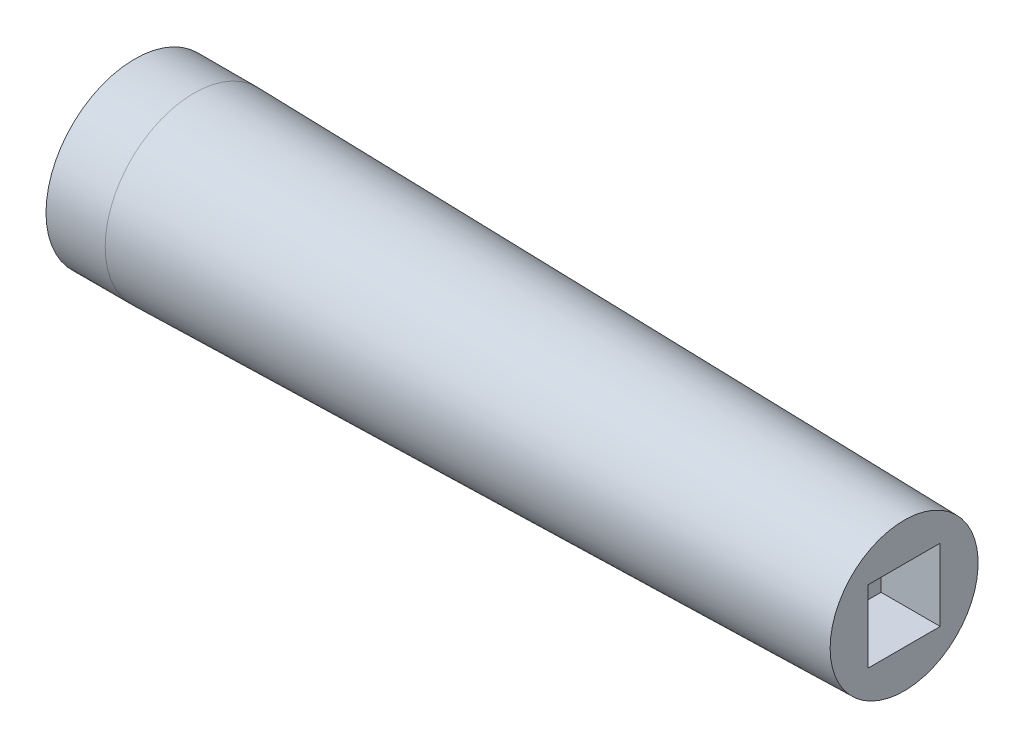
ISO-10303-21;
HEADER;
FILE_DESCRIPTION(('STEP AP214'),'2;1');
FILE_NAME('part.step','',(''),(''),'','','');
FILE_SCHEMA(('AUTOMOTIVE_DESIGN { 1 0 10303 214 1 1 1 1 }'));
ENDSEC;
DATA;
#1=APPLICATION_CONTEXT('core data for automotive mechanical design processes');
#2=APPLICATION_PROTOCOL_DEFINITION('international standard','automotive_design',2000,#1);
#3=PRODUCT_CONTEXT('',#1,'mechanical');
#4=PRODUCT('Part','Part','',(#3));
#5=PRODUCT_RELATED_PRODUCT_CATEGORY('part','',(#4));
#6=PRODUCT_DEFINITION_FORMATION('','',#4);
#7=PRODUCT_DEFINITION_CONTEXT('part definition',#1,'design');
#8=PRODUCT_DEFINITION('design','',#6,#7);
#9=PRODUCT_DEFINITION_SHAPE('','',#8);
#10=(LENGTH_UNIT() NAMED_UNIT(*) SI_UNIT(.MILLI.,.METRE.));
#11=(NAMED_UNIT(*) PLANE_ANGLE_UNIT() SI_UNIT($,.RADIAN.));
#12=(NAMED_UNIT(*) SI_UNIT($,.STERADIAN.) SOLID_ANGLE_UNIT());
#13=UNCERTAINTY_MEASURE_WITH_UNIT(LENGTH_MEASURE(1.E-05),#10,'distance_accuracy_value','');
#14=(GEOMETRIC_REPRESENTATION_CONTEXT(3) GLOBAL_UNCERTAINTY_ASSIGNED_CONTEXT((#13)) GLOBAL_UNIT_ASSIGNED_CONTEXT((#10,
#11,#12)) REPRESENTATION_CONTEXT('',''));
#15=CARTESIAN_POINT('',(0.,0.,0.));
#16=DIRECTION('',(0.,0.,1.));
#17=DIRECTION('',(1.,0.,0.));
#18=AXIS2_PLACEMENT_3D('',#15,#16,#17);
#19=CARTESIAN_POINT('',(0.,0.,-19.05));
#20=DIRECTION('',(1.,0.,0.));
#21=DIRECTION('',(0.,0.,-1.));
#22=AXIS2_PLACEMENT_3D('',#19,#20,#21);
#23=PLANE('',#22);
#24=CARTESIAN_POINT('',(0.,0.,0.));
#25=DIRECTION('',(-1.,0.,0.));
#26=DIRECTION('',(0.,0.,1.));
#27=AXIS2_PLACEMENT_3D('',#24,#25,#26);
#28=CIRCLE('',#27,19.05);
#29=CARTESIAN_POINT('',(0.,0.,19.05));
#30=VERTEX_POINT('',#29);
#31=EDGE_CURVE('E129',#30,#30,#28,.T.);
#32=ORIENTED_EDGE('',*,*,#31,.T.);
#33=EDGE_LOOP('',(#32));
#34=FACE_BOUND('',#33,.T.);
#35=ADVANCED_FACE('F43',(#34),#23,.F.);
#36=CARTESIAN_POINT('',(165.1,0.,0.));
#37=DIRECTION('',(-1.,0.,0.));
#38=DIRECTION('',(0.,0.,1.));
#39=AXIS2_PLACEMENT_3D('',#36,#37,#38);
#40=PLANE('',#39);
#41=DIRECTION('',(0.,0.,-1.));
#42=VECTOR('',#41,1.);
#43=CARTESIAN_POINT('',(165.1,-7.745,-7.745));
#44=LINE('',#43,#42);
#45=CARTESIAN_POINT('',(165.1,-7.745,7.745));
#46=VERTEX_POINT('',#45);
#47=CARTESIAN_POINT('',(165.1,-7.745,-7.745));
#48=VERTEX_POINT('',#47);
#49=EDGE_CURVE('E93',#46,#48,#44,.T.);
#50=ORIENTED_EDGE('',*,*,#49,.F.);
#51=DIRECTION('',(0.,-1.,0.));
#52=VECTOR('',#51,1.);
#53=CARTESIAN_POINT('',(165.1,7.745,7.745));
#54=LINE('',#53,#52);
#55=CARTESIAN_POINT('',(165.1,7.745,7.745));
#56=VERTEX_POINT('',#55);
#57=EDGE_CURVE('E58',#56,#46,#54,.T.);
#58=ORIENTED_EDGE('',*,*,#57,.F.);
#59=DIRECTION('',(0.,0.,1.));
#60=VECTOR('',#59,1.);
#61=CARTESIAN_POINT('',(165.1,7.745,-7.745));
#62=LINE('',#61,#60);
#63=CARTESIAN_POINT('',(165.1,7.745,-7.745));
#64=VERTEX_POINT('',#63);
#65=EDGE_CURVE('E113',#64,#56,#62,.T.);
#66=ORIENTED_EDGE('',*,*,#65,.F.);
#67=DIRECTION('',(0.,1.,0.));
#68=VECTOR('',#67,1.);
#69=CARTESIAN_POINT('',(165.1,7.745,-7.745));
#70=LINE('',#69,#68);
#71=EDGE_CURVE('E122',#48,#64,#70,.T.);
#72=ORIENTED_EDGE('',*,*,#71,.F.);
#73=EDGE_LOOP('',(#50,#58,#66,#72));
#74=FACE_BOUND('',#73,.T.);
#75=CARTESIAN_POINT('',(165.1,0.,0.));
#76=DIRECTION('',(-1.,0.,0.));
#77=DIRECTION('',(0.,0.,1.));
#78=AXIS2_PLACEMENT_3D('',#75,#76,#77);
#79=CIRCLE('',#78,15.88);
#80=CARTESIAN_POINT('',(165.1,0.,15.88));
#81=VERTEX_POINT('',#80);
#82=EDGE_CURVE('E11',#81,#81,#79,.T.);
#83=ORIENTED_EDGE('',*,*,#82,.F.);
#84=EDGE_LOOP('',(#83));
#85=FACE_BOUND('',#84,.T.);
#86=ADVANCED_FACE('F145',(#74,#85),#40,.F.);
#87=CARTESIAN_POINT('',(165.1,0.,0.));
#88=DIRECTION('',(-1.,0.,0.));
#89=DIRECTION('',(0.,0.,1.));
#90=AXIS2_PLACEMENT_3D('',#87,#88,#89);
#91=CONICAL_SURFACE('',#90,15.88,0.020797525848452);
#92=CARTESIAN_POINT('',(12.7,0.,0.));
#93=DIRECTION('',(-1.,0.,0.));
#94=DIRECTION('',(0.,0.,1.));
#95=AXIS2_PLACEMENT_3D('',#92,#93,#94);
#96=CIRCLE('',#95,19.05);
#97=CARTESIAN_POINT('',(12.7,0.,19.05));
#98=VERTEX_POINT('',#97);
#99=EDGE_CURVE('E51',#98,#98,#96,.T.);
#100=ORIENTED_EDGE('',*,*,#99,.F.);
#101=EDGE_LOOP('',(#100));
#102=FACE_BOUND('',#101,.T.);
#103=ORIENTED_EDGE('',*,*,#82,.T.);
#104=EDGE_LOOP('',(#103));
#105=FACE_BOUND('',#104,.T.);
#106=ADVANCED_FACE('F142',(#102,#105),#91,.T.);
#107=CARTESIAN_POINT('',(0.,0.,0.));
#108=DIRECTION('',(-1.,0.,0.));
#109=DIRECTION('',(0.,0.,1.));
#110=AXIS2_PLACEMENT_3D('',#107,#108,#109);
#111=CYLINDRICAL_SURFACE('',#110,19.05);
#112=ORIENTED_EDGE('',*,*,#31,.F.);
#113=EDGE_LOOP('',(#112));
#114=FACE_BOUND('',#113,.T.);
#115=ORIENTED_EDGE('',*,*,#99,.T.);
#116=EDGE_LOOP('',(#115));
#117=FACE_BOUND('',#116,.T.);
#118=ADVANCED_FACE('F140',(#114,#117),#111,.T.);
#119=CARTESIAN_POINT('',(152.4,7.745,7.745));
#120=DIRECTION('',(0.,0.,1.));
#121=DIRECTION('',(0.,-1.,0.));
#122=AXIS2_PLACEMENT_3D('',#119,#120,#121);
#123=PLANE('',#122);
#124=ORIENTED_EDGE('',*,*,#57,.T.);
#125=DIRECTION('',(1.,0.,0.));
#126=VECTOR('',#125,1.);
#127=CARTESIAN_POINT('',(152.4,-7.745,7.745));
#128=LINE('',#127,#126);
#129=CARTESIAN_POINT('',(152.4,-7.745,7.745));
#130=VERTEX_POINT('',#129);
#131=EDGE_CURVE('E81',#130,#46,#128,.T.);
#132=ORIENTED_EDGE('',*,*,#131,.F.);
#133=DIRECTION('',(0.,-1.,0.));
#134=VECTOR('',#133,1.);
#135=CARTESIAN_POINT('',(152.4,7.745,7.745));
#136=LINE('',#135,#134);
#137=CARTESIAN_POINT('',(152.4,7.745,7.745));
#138=VERTEX_POINT('',#137);
#139=EDGE_CURVE('E109',#138,#130,#136,.T.);
#140=ORIENTED_EDGE('',*,*,#139,.F.);
#141=DIRECTION('',(1.,0.,0.));
#142=VECTOR('',#141,1.);
#143=CARTESIAN_POINT('',(152.4,7.745,7.745));
#144=LINE('',#143,#142);
#145=EDGE_CURVE('E66',#138,#56,#144,.T.);
#146=ORIENTED_EDGE('',*,*,#145,.T.);
#147=EDGE_LOOP('',(#124,#132,#140,#146));
#148=FACE_BOUND('',#147,.T.);
#149=ADVANCED_FACE('F158',(#148),#123,.F.);
#150=CARTESIAN_POINT('',(152.4,7.745,-7.745));
#151=DIRECTION('',(0.,1.,0.));
#152=DIRECTION('',(0.,0.,1.));
#153=AXIS2_PLACEMENT_3D('',#150,#151,#152);
#154=PLANE('',#153);
#155=ORIENTED_EDGE('',*,*,#65,.T.);
#156=ORIENTED_EDGE('',*,*,#145,.F.);
#157=DIRECTION('',(0.,0.,1.));
#158=VECTOR('',#157,1.);
#159=CARTESIAN_POINT('',(152.4,7.745,-7.745));
#160=LINE('',#159,#158);
#161=CARTESIAN_POINT('',(152.4,7.745,-7.745));
#162=VERTEX_POINT('',#161);
#163=EDGE_CURVE('E106',#162,#138,#160,.T.);
#164=ORIENTED_EDGE('',*,*,#163,.F.);
#165=DIRECTION('',(1.,0.,0.));
#166=VECTOR('',#165,1.);
#167=CARTESIAN_POINT('',(152.4,7.745,-7.745));
#168=LINE('',#167,#166);
#169=EDGE_CURVE('E98',#162,#64,#168,.T.);
#170=ORIENTED_EDGE('',*,*,#169,.T.);
#171=EDGE_LOOP('',(#155,#156,#164,#170));
#172=FACE_BOUND('',#171,.T.);
#173=ADVANCED_FACE('F162',(#172),#154,.F.);
#174=CARTESIAN_POINT('',(152.4,7.745,-7.745));
#175=DIRECTION('',(0.,0.,-1.));
#176=DIRECTION('',(0.,1.,0.));
#177=AXIS2_PLACEMENT_3D('',#174,#175,#176);
#178=PLANE('',#177);
#179=ORIENTED_EDGE('',*,*,#71,.T.);
#180=ORIENTED_EDGE('',*,*,#169,.F.);
#181=DIRECTION('',(0.,1.,0.));
#182=VECTOR('',#181,1.);
#183=CARTESIAN_POINT('',(152.4,7.745,-7.745));
#184=LINE('',#183,#182);
#185=CARTESIAN_POINT('',(152.4,-7.745,-7.745));
#186=VERTEX_POINT('',#185);
#187=EDGE_CURVE('E101',#186,#162,#184,.T.);
#188=ORIENTED_EDGE('',*,*,#187,.F.);
#189=DIRECTION('',(1.,0.,0.));
#190=VECTOR('',#189,1.);
#191=CARTESIAN_POINT('',(152.4,-7.745,-7.745));
#192=LINE('',#191,#190);
#193=EDGE_CURVE('E86',#186,#48,#192,.T.);
#194=ORIENTED_EDGE('',*,*,#193,.T.);
#195=EDGE_LOOP('',(#179,#180,#188,#194));
#196=FACE_BOUND('',#195,.T.);
#197=ADVANCED_FACE('F102',(#196),#178,.F.);
#198=CARTESIAN_POINT('',(152.4,-7.745,-7.745));
#199=DIRECTION('',(0.,-1.,0.));
#200=DIRECTION('',(0.,0.,-1.));
#201=AXIS2_PLACEMENT_3D('',#198,#199,#200);
#202=PLANE('',#201);
#203=ORIENTED_EDGE('',*,*,#49,.T.);
#204=ORIENTED_EDGE('',*,*,#193,.F.);
#205=DIRECTION('',(0.,0.,-1.));
#206=VECTOR('',#205,1.);
#207=CARTESIAN_POINT('',(152.4,-7.745,-7.745));
#208=LINE('',#207,#206);
#209=EDGE_CURVE('E90',#130,#186,#208,.T.);
#210=ORIENTED_EDGE('',*,*,#209,.F.);
#211=ORIENTED_EDGE('',*,*,#131,.T.);
#212=EDGE_LOOP('',(#203,#204,#210,#211));
#213=FACE_BOUND('',#212,.T.);
#214=ADVANCED_FACE('F88',(#213),#202,.F.);
#215=CARTESIAN_POINT('',(152.4,0.,0.));
#216=DIRECTION('',(-1.,0.,0.));
#217=DIRECTION('',(0.,0.,1.));
#218=AXIS2_PLACEMENT_3D('',#215,#216,#217);
#219=PLANE('',#218);
#220=ORIENTED_EDGE('',*,*,#139,.T.);
#221=ORIENTED_EDGE('',*,*,#209,.T.);
#222=ORIENTED_EDGE('',*,*,#187,.T.);
#223=ORIENTED_EDGE('',*,*,#163,.T.);
#224=EDGE_LOOP('',(#220,#221,#222,#223));
#225=FACE_BOUND('',#224,.T.);
#226=ADVANCED_FACE('F108',(#225),#219,.F.);
#227=CLOSED_SHELL('',(#35,#86,#106,#118,#149,#173,#197,#214,#226));
#228=MANIFOLD_SOLID_BREP('B2',#227);
#229=ADVANCED_BREP_SHAPE_REPRESENTATION('',(#18,#228),#14);
#230=SHAPE_DEFINITION_REPRESENTATION(#9,#229);
ENDSEC;
END-ISO-10303-21;
